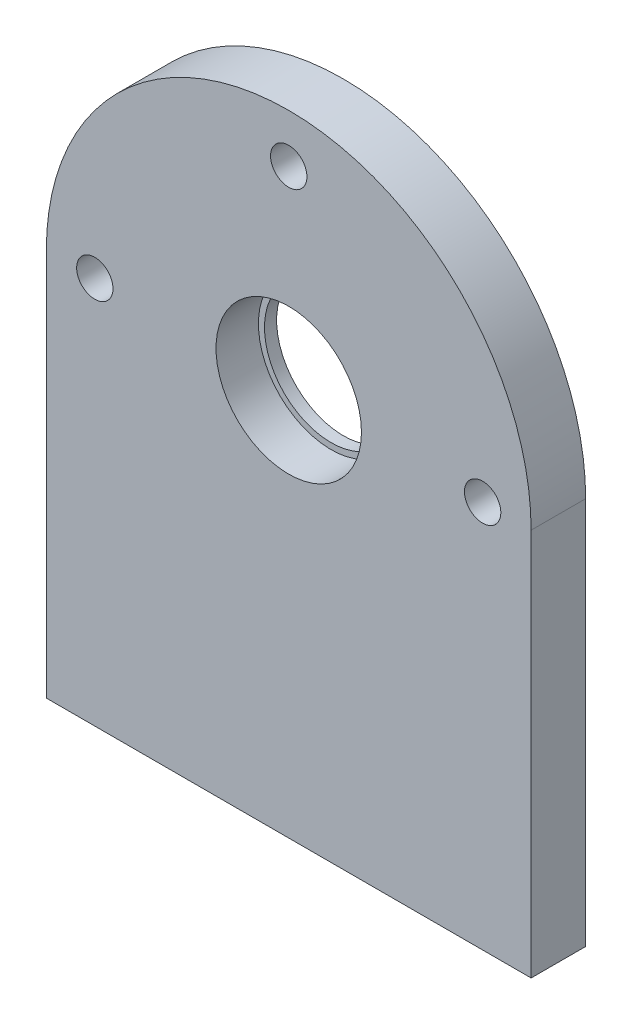
ISO-10303-21;
HEADER;
FILE_DESCRIPTION(('STEP AP214'),'2;1');
FILE_NAME('part.step','',(''),(''),'','','');
FILE_SCHEMA(('AUTOMOTIVE_DESIGN { 1 0 10303 214 1 1 1 1 }'));
ENDSEC;
DATA;
#1=APPLICATION_CONTEXT('core data for automotive mechanical design processes');
#2=APPLICATION_PROTOCOL_DEFINITION('international standard','automotive_design',2000,#1);
#3=PRODUCT_CONTEXT('',#1,'mechanical');
#4=PRODUCT('Part','Part','',(#3));
#5=PRODUCT_RELATED_PRODUCT_CATEGORY('part','',(#4));
#6=PRODUCT_DEFINITION_FORMATION('','',#4);
#7=PRODUCT_DEFINITION_CONTEXT('part definition',#1,'design');
#8=PRODUCT_DEFINITION('design','',#6,#7);
#9=PRODUCT_DEFINITION_SHAPE('','',#8);
#10=(LENGTH_UNIT() NAMED_UNIT(*) SI_UNIT(.MILLI.,.METRE.));
#11=(NAMED_UNIT(*) PLANE_ANGLE_UNIT() SI_UNIT($,.RADIAN.));
#12=(NAMED_UNIT(*) SI_UNIT($,.STERADIAN.) SOLID_ANGLE_UNIT());
#13=UNCERTAINTY_MEASURE_WITH_UNIT(LENGTH_MEASURE(1.E-05),#10,'distance_accuracy_value','');
#14=(GEOMETRIC_REPRESENTATION_CONTEXT(3) GLOBAL_UNCERTAINTY_ASSIGNED_CONTEXT((#13)) GLOBAL_UNIT_ASSIGNED_CONTEXT((#10,
#11,#12)) REPRESENTATION_CONTEXT('',''));
#15=CARTESIAN_POINT('',(0.,0.,0.));
#16=DIRECTION('',(0.,0.,1.));
#17=DIRECTION('',(1.,0.,0.));
#18=AXIS2_PLACEMENT_3D('',#15,#16,#17);
#19=CARTESIAN_POINT('',(0.,0.,4.5));
#20=DIRECTION('',(0.,0.,1.));
#21=DIRECTION('',(1.,0.,0.));
#22=AXIS2_PLACEMENT_3D('',#19,#20,#21);
#23=PLANE('',#22);
#24=CARTESIAN_POINT('',(0.,16.,4.5));
#25=DIRECTION('',(0.,0.,1.));
#26=DIRECTION('',(1.,0.,0.));
#27=AXIS2_PLACEMENT_3D('',#24,#25,#26);
#28=CIRCLE('',#27,1.5);
#29=CARTESIAN_POINT('',(1.5,16.,4.5));
#30=VERTEX_POINT('',#29);
#31=EDGE_CURVE('E141',#30,#30,#28,.T.);
#32=ORIENTED_EDGE('',*,*,#31,.F.);
#33=EDGE_LOOP('',(#32));
#34=FACE_BOUND('',#33,.T.);
#35=CARTESIAN_POINT('',(-16.,0.,4.5));
#36=DIRECTION('',(0.,0.,1.));
#37=DIRECTION('',(1.,0.,0.));
#38=AXIS2_PLACEMENT_3D('',#35,#36,#37);
#39=CIRCLE('',#38,1.5);
#40=CARTESIAN_POINT('',(-14.5,0.,4.5));
#41=VERTEX_POINT('',#40);
#42=EDGE_CURVE('E195',#41,#41,#39,.T.);
#43=ORIENTED_EDGE('',*,*,#42,.F.);
#44=EDGE_LOOP('',(#43));
#45=FACE_BOUND('',#44,.T.);
#46=CARTESIAN_POINT('',(16.,0.,4.5));
#47=DIRECTION('',(0.,0.,1.));
#48=DIRECTION('',(1.,0.,0.));
#49=AXIS2_PLACEMENT_3D('',#46,#47,#48);
#50=CIRCLE('',#49,1.5);
#51=CARTESIAN_POINT('',(17.5,0.,4.5));
#52=VERTEX_POINT('',#51);
#53=EDGE_CURVE('E199',#52,#52,#50,.T.);
#54=ORIENTED_EDGE('',*,*,#53,.F.);
#55=EDGE_LOOP('',(#54));
#56=FACE_BOUND('',#55,.T.);
#57=CARTESIAN_POINT('',(0.,0.,4.5));
#58=DIRECTION('',(0.,0.,1.));
#59=DIRECTION('',(1.,0.,0.));
#60=AXIS2_PLACEMENT_3D('',#57,#58,#59);
#61=CIRCLE('',#60,20.);
#62=CARTESIAN_POINT('',(20.,0.,4.5));
#63=VERTEX_POINT('',#62);
#64=CARTESIAN_POINT('',(-20.,0.,4.5));
#65=VERTEX_POINT('',#64);
#66=EDGE_CURVE('E100',#63,#65,#61,.T.);
#67=ORIENTED_EDGE('',*,*,#66,.T.);
#68=DIRECTION('',(0.,-1.,0.));
#69=VECTOR('',#68,1.);
#70=CARTESIAN_POINT('',(-20.,0.,4.5));
#71=LINE('',#70,#69);
#72=CARTESIAN_POINT('',(-20.,-32.,4.5));
#73=VERTEX_POINT('',#72);
#74=EDGE_CURVE('E95',#65,#73,#71,.T.);
#75=ORIENTED_EDGE('',*,*,#74,.T.);
#76=DIRECTION('',(1.,0.,0.));
#77=VECTOR('',#76,1.);
#78=CARTESIAN_POINT('',(20.,-32.,4.5));
#79=LINE('',#78,#77);
#80=CARTESIAN_POINT('',(20.,-32.,4.5));
#81=VERTEX_POINT('',#80);
#82=EDGE_CURVE('E98',#73,#81,#79,.T.);
#83=ORIENTED_EDGE('',*,*,#82,.T.);
#84=DIRECTION('',(0.,1.,0.));
#85=VECTOR('',#84,1.);
#86=CARTESIAN_POINT('',(20.,0.,4.5));
#87=LINE('',#86,#85);
#88=EDGE_CURVE('E64',#81,#63,#87,.T.);
#89=ORIENTED_EDGE('',*,*,#88,.T.);
#90=EDGE_LOOP('',(#67,#75,#83,#89));
#91=FACE_BOUND('',#90,.T.);
#92=CARTESIAN_POINT('',(0.,0.,4.5));
#93=DIRECTION('',(0.,0.,1.));
#94=DIRECTION('',(1.,0.,0.));
#95=AXIS2_PLACEMENT_3D('',#92,#93,#94);
#96=CIRCLE('',#95,6.);
#97=CARTESIAN_POINT('',(6.,0.,4.5));
#98=VERTEX_POINT('',#97);
#99=EDGE_CURVE('E124',#98,#98,#96,.T.);
#100=ORIENTED_EDGE('',*,*,#99,.F.);
#101=EDGE_LOOP('',(#100));
#102=FACE_BOUND('',#101,.T.);
#103=ADVANCED_FACE('F44',(#34,#45,#56,#91,#102),#23,.T.);
#104=CARTESIAN_POINT('',(0.,0.,0.));
#105=DIRECTION('',(0.,0.,1.));
#106=DIRECTION('',(1.,0.,0.));
#107=AXIS2_PLACEMENT_3D('',#104,#105,#106);
#108=PLANE('',#107);
#109=CARTESIAN_POINT('',(0.,16.,0.));
#110=DIRECTION('',(0.,0.,1.));
#111=DIRECTION('',(1.,0.,0.));
#112=AXIS2_PLACEMENT_3D('',#109,#110,#111);
#113=CIRCLE('',#112,1.5);
#114=CARTESIAN_POINT('',(1.5,16.,0.));
#115=VERTEX_POINT('',#114);
#116=EDGE_CURVE('E48',#115,#115,#113,.F.);
#117=ORIENTED_EDGE('',*,*,#116,.F.);
#118=EDGE_LOOP('',(#117));
#119=FACE_BOUND('',#118,.T.);
#120=CARTESIAN_POINT('',(-16.,0.,0.));
#121=DIRECTION('',(0.,0.,1.));
#122=DIRECTION('',(1.,0.,0.));
#123=AXIS2_PLACEMENT_3D('',#120,#121,#122);
#124=CIRCLE('',#123,1.5);
#125=CARTESIAN_POINT('',(-14.5,0.,0.));
#126=VERTEX_POINT('',#125);
#127=EDGE_CURVE('E140',#126,#126,#124,.F.);
#128=ORIENTED_EDGE('',*,*,#127,.F.);
#129=EDGE_LOOP('',(#128));
#130=FACE_BOUND('',#129,.T.);
#131=CARTESIAN_POINT('',(16.,0.,0.));
#132=DIRECTION('',(0.,0.,1.));
#133=DIRECTION('',(1.,0.,0.));
#134=AXIS2_PLACEMENT_3D('',#131,#132,#133);
#135=CIRCLE('',#134,1.5);
#136=CARTESIAN_POINT('',(17.5,0.,0.));
#137=VERTEX_POINT('',#136);
#138=EDGE_CURVE('E137',#137,#137,#135,.F.);
#139=ORIENTED_EDGE('',*,*,#138,.F.);
#140=EDGE_LOOP('',(#139));
#141=FACE_BOUND('',#140,.T.);
#142=CARTESIAN_POINT('',(0.,0.,0.));
#143=DIRECTION('',(0.,0.,1.));
#144=DIRECTION('',(1.,0.,0.));
#145=AXIS2_PLACEMENT_3D('',#142,#143,#144);
#146=CIRCLE('',#145,20.);
#147=CARTESIAN_POINT('',(20.,0.,0.));
#148=VERTEX_POINT('',#147);
#149=CARTESIAN_POINT('',(-20.,0.,0.));
#150=VERTEX_POINT('',#149);
#151=EDGE_CURVE('E120',#148,#150,#146,.T.);
#152=ORIENTED_EDGE('',*,*,#151,.F.);
#153=DIRECTION('',(0.,1.,0.));
#154=VECTOR('',#153,1.);
#155=CARTESIAN_POINT('',(20.,0.,0.));
#156=LINE('',#155,#154);
#157=CARTESIAN_POINT('',(20.,-32.,0.));
#158=VERTEX_POINT('',#157);
#159=EDGE_CURVE('E87',#158,#148,#156,.T.);
#160=ORIENTED_EDGE('',*,*,#159,.F.);
#161=DIRECTION('',(1.,0.,0.));
#162=VECTOR('',#161,1.);
#163=CARTESIAN_POINT('',(20.,-32.,0.));
#164=LINE('',#163,#162);
#165=CARTESIAN_POINT('',(-20.,-32.,0.));
#166=VERTEX_POINT('',#165);
#167=EDGE_CURVE('E81',#166,#158,#164,.T.);
#168=ORIENTED_EDGE('',*,*,#167,.F.);
#169=DIRECTION('',(0.,-1.,0.));
#170=VECTOR('',#169,1.);
#171=CARTESIAN_POINT('',(-20.,0.,0.));
#172=LINE('',#171,#170);
#173=EDGE_CURVE('E106',#150,#166,#172,.T.);
#174=ORIENTED_EDGE('',*,*,#173,.F.);
#175=EDGE_LOOP('',(#152,#160,#168,#174));
#176=FACE_BOUND('',#175,.T.);
#177=CARTESIAN_POINT('',(0.,0.,0.));
#178=DIRECTION('',(0.,0.,1.));
#179=DIRECTION('',(1.,0.,0.));
#180=AXIS2_PLACEMENT_3D('',#177,#178,#179);
#181=CIRCLE('',#180,5.5);
#182=CARTESIAN_POINT('',(5.5,0.,0.));
#183=VERTEX_POINT('',#182);
#184=EDGE_CURVE('E150',#183,#183,#181,.T.);
#185=ORIENTED_EDGE('',*,*,#184,.T.);
#186=EDGE_LOOP('',(#185));
#187=FACE_BOUND('',#186,.T.);
#188=ADVANCED_FACE('F246',(#119,#130,#141,#176,#187),#108,.F.);
#189=CARTESIAN_POINT('',(0.,0.,4.5));
#190=DIRECTION('',(0.,0.,-1.));
#191=DIRECTION('',(-1.,0.,0.));
#192=AXIS2_PLACEMENT_3D('',#189,#190,#191);
#193=CYLINDRICAL_SURFACE('',#192,20.);
#194=ORIENTED_EDGE('',*,*,#151,.T.);
#195=DIRECTION('',(0.,0.,-1.));
#196=VECTOR('',#195,1.);
#197=CARTESIAN_POINT('',(-20.,0.,4.5));
#198=LINE('',#197,#196);
#199=EDGE_CURVE('E55',#65,#150,#198,.T.);
#200=ORIENTED_EDGE('',*,*,#199,.F.);
#201=ORIENTED_EDGE('',*,*,#66,.F.);
#202=DIRECTION('',(0.,0.,-1.));
#203=VECTOR('',#202,1.);
#204=CARTESIAN_POINT('',(20.,0.,4.5));
#205=LINE('',#204,#203);
#206=EDGE_CURVE('E116',#63,#148,#205,.T.);
#207=ORIENTED_EDGE('',*,*,#206,.T.);
#208=EDGE_LOOP('',(#194,#200,#201,#207));
#209=FACE_BOUND('',#208,.T.);
#210=ADVANCED_FACE('F46',(#209),#193,.T.);
#211=CARTESIAN_POINT('',(-20.,0.,4.5));
#212=DIRECTION('',(1.,0.,0.));
#213=DIRECTION('',(0.,0.,-1.));
#214=AXIS2_PLACEMENT_3D('',#211,#212,#213);
#215=PLANE('',#214);
#216=ORIENTED_EDGE('',*,*,#173,.T.);
#217=DIRECTION('',(0.,0.,-1.));
#218=VECTOR('',#217,1.);
#219=CARTESIAN_POINT('',(-20.,-32.,4.5));
#220=LINE('',#219,#218);
#221=EDGE_CURVE('E104',#73,#166,#220,.T.);
#222=ORIENTED_EDGE('',*,*,#221,.F.);
#223=ORIENTED_EDGE('',*,*,#74,.F.);
#224=ORIENTED_EDGE('',*,*,#199,.T.);
#225=EDGE_LOOP('',(#216,#222,#223,#224));
#226=FACE_BOUND('',#225,.T.);
#227=ADVANCED_FACE('F105',(#226),#215,.F.);
#228=CARTESIAN_POINT('',(20.,-32.,4.5));
#229=DIRECTION('',(0.,1.,0.));
#230=DIRECTION('',(0.,0.,1.));
#231=AXIS2_PLACEMENT_3D('',#228,#229,#230);
#232=PLANE('',#231);
#233=CARTESIAN_POINT('',(9.,-32.,2.25));
#234=DIRECTION('',(0.,-1.,0.));
#235=DIRECTION('',(0.,0.,-1.));
#236=AXIS2_PLACEMENT_3D('',#233,#234,#235);
#237=CIRCLE('',#236,1.5);
#238=CARTESIAN_POINT('',(9.,-32.,0.750000000000003));
#239=VERTEX_POINT('',#238);
#240=EDGE_CURVE('E212',#239,#239,#237,.T.);
#241=ORIENTED_EDGE('',*,*,#240,.F.);
#242=EDGE_LOOP('',(#241));
#243=FACE_BOUND('',#242,.T.);
#244=CARTESIAN_POINT('',(-9.,-32.,2.25));
#245=DIRECTION('',(0.,-1.,0.));
#246=DIRECTION('',(0.,0.,-1.));
#247=AXIS2_PLACEMENT_3D('',#244,#245,#246);
#248=CIRCLE('',#247,1.5);
#249=CARTESIAN_POINT('',(-9.,-32.,0.75));
#250=VERTEX_POINT('',#249);
#251=EDGE_CURVE('E228',#250,#250,#248,.T.);
#252=ORIENTED_EDGE('',*,*,#251,.F.);
#253=EDGE_LOOP('',(#252));
#254=FACE_BOUND('',#253,.T.);
#255=ORIENTED_EDGE('',*,*,#167,.T.);
#256=DIRECTION('',(0.,0.,-1.));
#257=VECTOR('',#256,1.);
#258=CARTESIAN_POINT('',(20.,-32.,4.5));
#259=LINE('',#258,#257);
#260=EDGE_CURVE('E108',#81,#158,#259,.T.);
#261=ORIENTED_EDGE('',*,*,#260,.F.);
#262=ORIENTED_EDGE('',*,*,#82,.F.);
#263=ORIENTED_EDGE('',*,*,#221,.T.);
#264=EDGE_LOOP('',(#255,#261,#262,#263));
#265=FACE_BOUND('',#264,.T.);
#266=ADVANCED_FACE('F110',(#243,#254,#265),#232,.F.);
#267=CARTESIAN_POINT('',(20.,0.,4.5));
#268=DIRECTION('',(-1.,0.,0.));
#269=DIRECTION('',(0.,0.,1.));
#270=AXIS2_PLACEMENT_3D('',#267,#268,#269);
#271=PLANE('',#270);
#272=ORIENTED_EDGE('',*,*,#159,.T.);
#273=ORIENTED_EDGE('',*,*,#206,.F.);
#274=ORIENTED_EDGE('',*,*,#88,.F.);
#275=ORIENTED_EDGE('',*,*,#260,.T.);
#276=EDGE_LOOP('',(#272,#273,#274,#275));
#277=FACE_BOUND('',#276,.T.);
#278=ADVANCED_FACE('F260',(#277),#271,.F.);
#279=CARTESIAN_POINT('',(0.,0.,4.5));
#280=DIRECTION('',(0.,0.,-1.));
#281=DIRECTION('',(-1.,0.,0.));
#282=AXIS2_PLACEMENT_3D('',#279,#280,#281);
#283=CYLINDRICAL_SURFACE('',#282,6.);
#284=CARTESIAN_POINT('',(0.,0.,1.));
#285=DIRECTION('',(0.,0.,1.));
#286=DIRECTION('',(1.,0.,0.));
#287=AXIS2_PLACEMENT_3D('',#284,#285,#286);
#288=CIRCLE('',#287,6.);
#289=CARTESIAN_POINT('',(6.,0.,1.));
#290=VERTEX_POINT('',#289);
#291=EDGE_CURVE('E11',#290,#290,#288,.T.);
#292=ORIENTED_EDGE('',*,*,#291,.F.);
#293=EDGE_LOOP('',(#292));
#294=FACE_BOUND('',#293,.T.);
#295=ORIENTED_EDGE('',*,*,#99,.T.);
#296=EDGE_LOOP('',(#295));
#297=FACE_BOUND('',#296,.T.);
#298=ADVANCED_FACE('F257',(#294,#297),#283,.F.);
#299=CARTESIAN_POINT('',(0.,0.,1.));
#300=DIRECTION('',(0.,0.,1.));
#301=DIRECTION('',(1.,0.,0.));
#302=AXIS2_PLACEMENT_3D('',#299,#300,#301);
#303=PLANE('',#302);
#304=ORIENTED_EDGE('',*,*,#291,.T.);
#305=EDGE_LOOP('',(#304));
#306=FACE_BOUND('',#305,.T.);
#307=CARTESIAN_POINT('',(0.,0.,1.));
#308=DIRECTION('',(0.,0.,1.));
#309=DIRECTION('',(1.,0.,0.));
#310=AXIS2_PLACEMENT_3D('',#307,#308,#309);
#311=CIRCLE('',#310,5.5);
#312=CARTESIAN_POINT('',(5.5,0.,1.));
#313=VERTEX_POINT('',#312);
#314=EDGE_CURVE('E157',#313,#313,#311,.T.);
#315=ORIENTED_EDGE('',*,*,#314,.F.);
#316=EDGE_LOOP('',(#315));
#317=FACE_BOUND('',#316,.T.);
#318=ADVANCED_FACE('F405',(#306,#317),#303,.T.);
#319=CARTESIAN_POINT('',(0.,0.,1.));
#320=DIRECTION('',(0.,0.,-1.));
#321=DIRECTION('',(-1.,0.,0.));
#322=AXIS2_PLACEMENT_3D('',#319,#320,#321);
#323=CYLINDRICAL_SURFACE('',#322,5.5);
#324=ORIENTED_EDGE('',*,*,#314,.T.);
#325=EDGE_LOOP('',(#324));
#326=FACE_BOUND('',#325,.T.);
#327=ORIENTED_EDGE('',*,*,#184,.F.);
#328=EDGE_LOOP('',(#327));
#329=FACE_BOUND('',#328,.T.);
#330=ADVANCED_FACE('F290',(#326,#329),#323,.F.);
#331=CARTESIAN_POINT('',(16.,0.,4.5));
#332=DIRECTION('',(0.,0.,-1.));
#333=DIRECTION('',(-1.,0.,0.));
#334=AXIS2_PLACEMENT_3D('',#331,#332,#333);
#335=CYLINDRICAL_SURFACE('',#334,1.5);
#336=ORIENTED_EDGE('',*,*,#53,.T.);
#337=EDGE_LOOP('',(#336));
#338=FACE_BOUND('',#337,.T.);
#339=ORIENTED_EDGE('',*,*,#138,.T.);
#340=EDGE_LOOP('',(#339));
#341=FACE_BOUND('',#340,.T.);
#342=ADVANCED_FACE('F242',(#338,#341),#335,.F.);
#343=CARTESIAN_POINT('',(-16.,0.,4.5));
#344=DIRECTION('',(0.,0.,-1.));
#345=DIRECTION('',(-1.,0.,0.));
#346=AXIS2_PLACEMENT_3D('',#343,#344,#345);
#347=CYLINDRICAL_SURFACE('',#346,1.5);
#348=ORIENTED_EDGE('',*,*,#42,.T.);
#349=EDGE_LOOP('',(#348));
#350=FACE_BOUND('',#349,.T.);
#351=ORIENTED_EDGE('',*,*,#127,.T.);
#352=EDGE_LOOP('',(#351));
#353=FACE_BOUND('',#352,.T.);
#354=ADVANCED_FACE('F307',(#350,#353),#347,.F.);
#355=CARTESIAN_POINT('',(0.,16.,4.5));
#356=DIRECTION('',(0.,0.,-1.));
#357=DIRECTION('',(-1.,0.,0.));
#358=AXIS2_PLACEMENT_3D('',#355,#356,#357);
#359=CYLINDRICAL_SURFACE('',#358,1.5);
#360=ORIENTED_EDGE('',*,*,#31,.T.);
#361=EDGE_LOOP('',(#360));
#362=FACE_BOUND('',#361,.T.);
#363=ORIENTED_EDGE('',*,*,#116,.T.);
#364=EDGE_LOOP('',(#363));
#365=FACE_BOUND('',#364,.T.);
#366=ADVANCED_FACE('F317',(#362,#365),#359,.F.);
#367=CARTESIAN_POINT('',(-9.,-27.,2.25));
#368=DIRECTION('',(0.,-1.,0.));
#369=DIRECTION('',(0.,0.,-1.));
#370=AXIS2_PLACEMENT_3D('',#367,#368,#369);
#371=CYLINDRICAL_SURFACE('',#370,1.5);
#372=CARTESIAN_POINT('',(-9.,-27.,2.25));
#373=DIRECTION('',(0.,-1.,0.));
#374=DIRECTION('',(0.,0.,-1.));
#375=AXIS2_PLACEMENT_3D('',#372,#373,#374);
#376=CIRCLE('',#375,1.5);
#377=CARTESIAN_POINT('',(-9.,-27.,0.75));
#378=VERTEX_POINT('',#377);
#379=EDGE_CURVE('E221',#378,#378,#376,.T.);
#380=ORIENTED_EDGE('',*,*,#379,.F.);
#381=EDGE_LOOP('',(#380));
#382=FACE_BOUND('',#381,.T.);
#383=ORIENTED_EDGE('',*,*,#251,.T.);
#384=EDGE_LOOP('',(#383));
#385=FACE_BOUND('',#384,.T.);
#386=ADVANCED_FACE('F328',(#382,#385),#371,.F.);
#387=CARTESIAN_POINT('',(-9.,-27.,2.25));
#388=DIRECTION('',(0.,-1.,0.));
#389=DIRECTION('',(0.,0.,-1.));
#390=AXIS2_PLACEMENT_3D('',#387,#388,#389);
#391=PLANE('',#390);
#392=ORIENTED_EDGE('',*,*,#379,.T.);
#393=EDGE_LOOP('',(#392));
#394=FACE_BOUND('',#393,.T.);
#395=ADVANCED_FACE('F350',(#394),#391,.T.);
#396=CARTESIAN_POINT('',(9.,-27.,2.25));
#397=DIRECTION('',(0.,-1.,0.));
#398=DIRECTION('',(0.,0.,-1.));
#399=AXIS2_PLACEMENT_3D('',#396,#397,#398);
#400=CYLINDRICAL_SURFACE('',#399,1.5);
#401=CARTESIAN_POINT('',(9.,-27.,2.25));
#402=DIRECTION('',(0.,-1.,0.));
#403=DIRECTION('',(0.,0.,-1.));
#404=AXIS2_PLACEMENT_3D('',#401,#402,#403);
#405=CIRCLE('',#404,1.5);
#406=CARTESIAN_POINT('',(9.,-27.,0.750000000000003));
#407=VERTEX_POINT('',#406);
#408=EDGE_CURVE('E209',#407,#407,#405,.T.);
#409=ORIENTED_EDGE('',*,*,#408,.F.);
#410=EDGE_LOOP('',(#409));
#411=FACE_BOUND('',#410,.T.);
#412=ORIENTED_EDGE('',*,*,#240,.T.);
#413=EDGE_LOOP('',(#412));
#414=FACE_BOUND('',#413,.T.);
#415=ADVANCED_FACE('F361',(#411,#414),#400,.F.);
#416=CARTESIAN_POINT('',(9.,-27.,2.25));
#417=DIRECTION('',(0.,-1.,0.));
#418=DIRECTION('',(0.,0.,-1.));
#419=AXIS2_PLACEMENT_3D('',#416,#417,#418);
#420=PLANE('',#419);
#421=ORIENTED_EDGE('',*,*,#408,.T.);
#422=EDGE_LOOP('',(#421));
#423=FACE_BOUND('',#422,.T.);
#424=ADVANCED_FACE('F372',(#423),#420,.T.);
#425=CLOSED_SHELL('',(#103,#188,#210,#227,#266,#278,#298,#318,#330,#342,#354,#366,#386,#395,
#415,#424));
#426=MANIFOLD_SOLID_BREP('B2',#425);
#427=ADVANCED_BREP_SHAPE_REPRESENTATION('',(#18,#426),#14);
#428=SHAPE_DEFINITION_REPRESENTATION(#9,#427);
ENDSEC;
END-ISO-10303-21;
